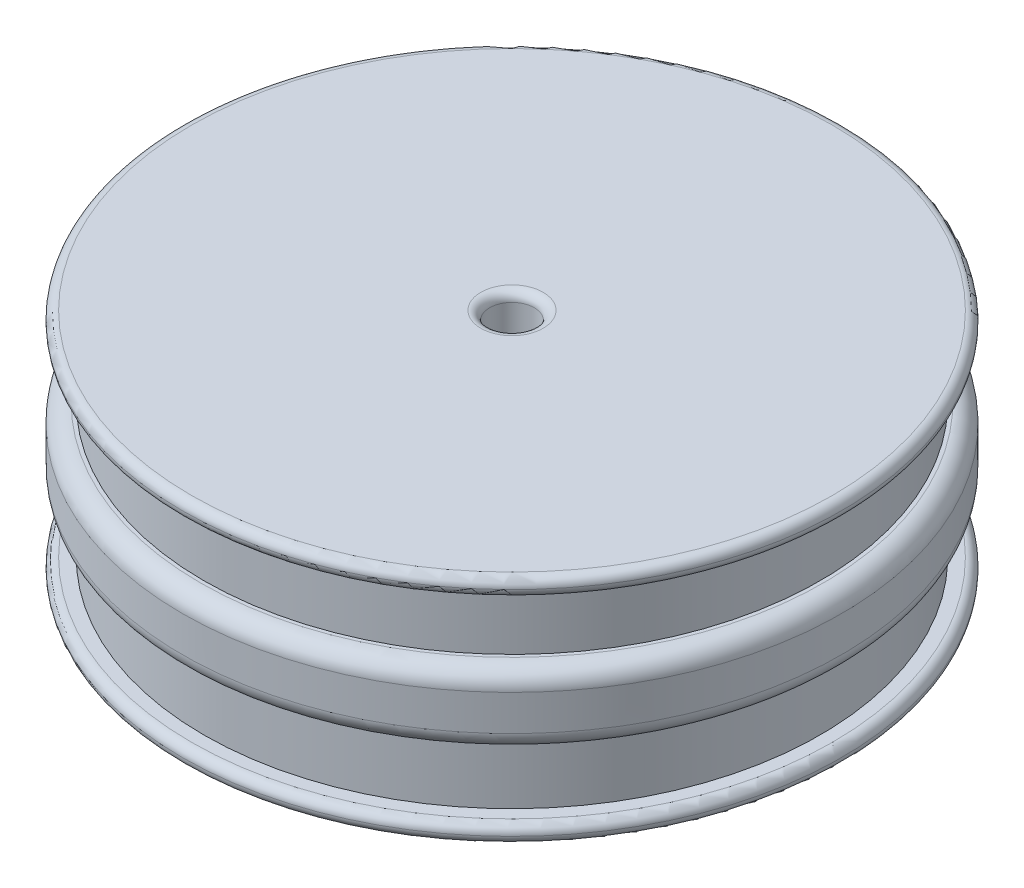
ISO-10303-21;
HEADER;
FILE_DESCRIPTION(('STEP AP214'),'2;1');
FILE_NAME('part.step','',(''),(''),'','','');
FILE_SCHEMA(('AUTOMOTIVE_DESIGN { 1 0 10303 214 1 1 1 1 }'));
ENDSEC;
DATA;
#1=APPLICATION_CONTEXT('core data for automotive mechanical design processes');
#2=APPLICATION_PROTOCOL_DEFINITION('international standard','automotive_design',2000,#1);
#3=PRODUCT_CONTEXT('',#1,'mechanical');
#4=PRODUCT('Part','Part','',(#3));
#5=PRODUCT_RELATED_PRODUCT_CATEGORY('part','',(#4));
#6=PRODUCT_DEFINITION_FORMATION('','',#4);
#7=PRODUCT_DEFINITION_CONTEXT('part definition',#1,'design');
#8=PRODUCT_DEFINITION('design','',#6,#7);
#9=PRODUCT_DEFINITION_SHAPE('','',#8);
#10=(LENGTH_UNIT() NAMED_UNIT(*) SI_UNIT(.MILLI.,.METRE.));
#11=(NAMED_UNIT(*) PLANE_ANGLE_UNIT() SI_UNIT($,.RADIAN.));
#12=(NAMED_UNIT(*) SI_UNIT($,.STERADIAN.) SOLID_ANGLE_UNIT());
#13=UNCERTAINTY_MEASURE_WITH_UNIT(LENGTH_MEASURE(1.E-05),#10,'distance_accuracy_value','');
#14=(GEOMETRIC_REPRESENTATION_CONTEXT(3) GLOBAL_UNCERTAINTY_ASSIGNED_CONTEXT((#13)) GLOBAL_UNIT_ASSIGNED_CONTEXT((#10,
#11,#12)) REPRESENTATION_CONTEXT('',''));
#15=CARTESIAN_POINT('',(0.,0.,0.));
#16=DIRECTION('',(0.,0.,1.));
#17=DIRECTION('',(1.,0.,0.));
#18=AXIS2_PLACEMENT_3D('',#15,#16,#17);
#19=CARTESIAN_POINT('',(0.,13.,0.));
#20=DIRECTION('',(0.,1.,0.));
#21=DIRECTION('',(0.,0.,1.));
#22=AXIS2_PLACEMENT_3D('',#19,#20,#21);
#23=PLANE('',#22);
#24=CARTESIAN_POINT('',(0.,13.,0.));
#25=DIRECTION('',(0.,1.,0.));
#26=DIRECTION('',(0.,0.,1.));
#27=AXIS2_PLACEMENT_3D('',#24,#25,#26);
#28=CIRCLE('',#27,1.75);
#29=CARTESIAN_POINT('',(0.,13.,1.75));
#30=VERTEX_POINT('',#29);
#31=EDGE_CURVE('E10',#30,#30,#28,.F.);
#32=ORIENTED_EDGE('',*,*,#31,.T.);
#33=EDGE_LOOP('',(#32));
#34=FACE_BOUND('',#33,.T.);
#35=CARTESIAN_POINT('',(0.,13.,0.));
#36=DIRECTION('',(0.,1.,0.));
#37=DIRECTION('',(0.,0.,1.));
#38=AXIS2_PLACEMENT_3D('',#35,#36,#37);
#39=CIRCLE('',#38,18.);
#40=CARTESIAN_POINT('',(0.,13.,18.));
#41=VERTEX_POINT('',#40);
#42=EDGE_CURVE('E65',#41,#41,#39,.T.);
#43=ORIENTED_EDGE('',*,*,#42,.T.);
#44=EDGE_LOOP('',(#43));
#45=FACE_BOUND('',#44,.T.);
#46=ADVANCED_FACE('F41',(#34,#45),#23,.T.);
#47=CARTESIAN_POINT('',(0.,0.,0.));
#48=DIRECTION('',(0.,1.,0.));
#49=DIRECTION('',(0.,0.,1.));
#50=AXIS2_PLACEMENT_3D('',#47,#48,#49);
#51=PLANE('',#50);
#52=CARTESIAN_POINT('',(0.,0.,0.));
#53=DIRECTION('',(0.,1.,0.));
#54=DIRECTION('',(0.,0.,1.));
#55=AXIS2_PLACEMENT_3D('',#52,#53,#54);
#56=CIRCLE('',#55,1.75);
#57=CARTESIAN_POINT('',(0.,0.,1.75));
#58=VERTEX_POINT('',#57);
#59=EDGE_CURVE('E59',#58,#58,#56,.T.);
#60=ORIENTED_EDGE('',*,*,#59,.T.);
#61=EDGE_LOOP('',(#60));
#62=FACE_BOUND('',#61,.T.);
#63=CARTESIAN_POINT('',(0.,0.,0.));
#64=DIRECTION('',(0.,1.,0.));
#65=DIRECTION('',(0.,0.,1.));
#66=AXIS2_PLACEMENT_3D('',#63,#64,#65);
#67=CIRCLE('',#66,18.);
#68=CARTESIAN_POINT('',(0.,0.,18.));
#69=VERTEX_POINT('',#68);
#70=EDGE_CURVE('E69',#69,#69,#67,.F.);
#71=ORIENTED_EDGE('',*,*,#70,.T.);
#72=EDGE_LOOP('',(#71));
#73=FACE_BOUND('',#72,.T.);
#74=ADVANCED_FACE('F140',(#62,#73),#51,.F.);
#75=CARTESIAN_POINT('',(0.,13.,0.));
#76=DIRECTION('',(0.,-1.,0.));
#77=DIRECTION('',(0.,0.,-1.));
#78=AXIS2_PLACEMENT_3D('',#75,#76,#77);
#79=CYLINDRICAL_SURFACE('',#78,1.25);
#80=CARTESIAN_POINT('',(0.,0.500000000000002,0.));
#81=DIRECTION('',(0.,1.,0.));
#82=DIRECTION('',(0.,0.,1.));
#83=AXIS2_PLACEMENT_3D('',#80,#81,#82);
#84=CIRCLE('',#83,1.25);
#85=CARTESIAN_POINT('',(0.,0.5,-1.25));
#86=VERTEX_POINT('',#85);
#87=EDGE_CURVE('E49',#86,#86,#84,.F.);
#88=CARTESIAN_POINT('',(0.,12.5,0.));
#89=DIRECTION('',(0.,1.,0.));
#90=DIRECTION('',(0.,0.,1.));
#91=AXIS2_PLACEMENT_3D('',#88,#89,#90);
#92=CIRCLE('',#91,1.25);
#93=CARTESIAN_POINT('',(0.,12.5,-1.25));
#94=VERTEX_POINT('',#93);
#95=EDGE_CURVE('E54',#94,#94,#92,.T.);
#96=CARTESIAN_POINT('',(0.,0.5,-1.25));
#97=CARTESIAN_POINT('',(0.,0.625000000000001,-1.25));
#98=CARTESIAN_POINT('',(0.,0.750000000000001,-1.25));
#99=CARTESIAN_POINT('',(0.,1.,-1.25));
#100=CARTESIAN_POINT('',(0.,1.125,-1.25));
#101=CARTESIAN_POINT('',(0.,1.375,-1.25));
#102=CARTESIAN_POINT('',(0.,1.5,-1.25));
#103=CARTESIAN_POINT('',(0.,1.75,-1.25));
#104=CARTESIAN_POINT('',(0.,1.875,-1.25));
#105=CARTESIAN_POINT('',(0.,2.125,-1.25));
#106=CARTESIAN_POINT('',(0.,2.25,-1.25));
#107=CARTESIAN_POINT('',(0.,2.5,-1.25));
#108=CARTESIAN_POINT('',(0.,2.625,-1.25));
#109=CARTESIAN_POINT('',(0.,2.875,-1.25));
#110=CARTESIAN_POINT('',(0.,3.,-1.25));
#111=CARTESIAN_POINT('',(0.,3.25,-1.25));
#112=CARTESIAN_POINT('',(0.,3.375,-1.25));
#113=CARTESIAN_POINT('',(0.,3.625,-1.25));
#114=CARTESIAN_POINT('',(0.,3.75,-1.25));
#115=CARTESIAN_POINT('',(0.,4.,-1.25));
#116=CARTESIAN_POINT('',(0.,4.125,-1.25));
#117=CARTESIAN_POINT('',(0.,4.375,-1.25));
#118=CARTESIAN_POINT('',(0.,4.5,-1.25));
#119=CARTESIAN_POINT('',(0.,4.75,-1.25));
#120=CARTESIAN_POINT('',(0.,4.875,-1.25));
#121=CARTESIAN_POINT('',(0.,5.125,-1.25));
#122=CARTESIAN_POINT('',(0.,5.25,-1.25));
#123=CARTESIAN_POINT('',(0.,5.5,-1.25));
#124=CARTESIAN_POINT('',(0.,5.625,-1.25));
#125=CARTESIAN_POINT('',(0.,5.875,-1.25));
#126=CARTESIAN_POINT('',(0.,6.,-1.25));
#127=CARTESIAN_POINT('',(0.,6.25,-1.25));
#128=CARTESIAN_POINT('',(0.,6.375,-1.25));
#129=CARTESIAN_POINT('',(0.,6.625,-1.25));
#130=CARTESIAN_POINT('',(0.,6.75,-1.25));
#131=CARTESIAN_POINT('',(0.,7.,-1.25));
#132=CARTESIAN_POINT('',(0.,7.125,-1.25));
#133=CARTESIAN_POINT('',(0.,7.375,-1.25));
#134=CARTESIAN_POINT('',(0.,7.5,-1.25));
#135=CARTESIAN_POINT('',(0.,7.75,-1.25));
#136=CARTESIAN_POINT('',(0.,7.875,-1.25));
#137=CARTESIAN_POINT('',(0.,8.125,-1.25));
#138=CARTESIAN_POINT('',(0.,8.25,-1.25));
#139=CARTESIAN_POINT('',(0.,8.5,-1.25));
#140=CARTESIAN_POINT('',(0.,8.625,-1.25));
#141=CARTESIAN_POINT('',(0.,8.875,-1.25));
#142=CARTESIAN_POINT('',(0.,9.,-1.25));
#143=CARTESIAN_POINT('',(0.,9.25,-1.25));
#144=CARTESIAN_POINT('',(0.,9.375,-1.25));
#145=CARTESIAN_POINT('',(0.,9.625,-1.25));
#146=CARTESIAN_POINT('',(0.,9.75,-1.25));
#147=CARTESIAN_POINT('',(0.,10.,-1.25));
#148=CARTESIAN_POINT('',(0.,10.125,-1.25));
#149=CARTESIAN_POINT('',(0.,10.375,-1.25));
#150=CARTESIAN_POINT('',(0.,10.5,-1.25));
#151=CARTESIAN_POINT('',(0.,10.75,-1.25));
#152=CARTESIAN_POINT('',(0.,10.875,-1.25));
#153=CARTESIAN_POINT('',(0.,11.125,-1.25));
#154=CARTESIAN_POINT('',(0.,11.25,-1.25));
#155=CARTESIAN_POINT('',(0.,11.5,-1.25));
#156=CARTESIAN_POINT('',(0.,11.625,-1.25));
#157=CARTESIAN_POINT('',(0.,11.875,-1.25));
#158=CARTESIAN_POINT('',(0.,12.,-1.25));
#159=CARTESIAN_POINT('',(0.,12.25,-1.25));
#160=CARTESIAN_POINT('',(0.,12.375,-1.25));
#161=CARTESIAN_POINT('',(0.,12.5,-1.25));
#162=B_SPLINE_CURVE_WITH_KNOTS('',3,(#96,#97,#98,#99,#100,#101,#102,#103,#104,#105,#106,#107,
#108,#109,#110,#111,#112,#113,#114,#115,#116,#117,#118,#119,#120,#121,#122,#123,#124,#125,#126,
#127,#128,#129,#130,#131,#132,#133,#134,#135,#136,#137,#138,#139,#140,#141,#142,#143,#144,#145,
#146,#147,#148,#149,#150,#151,#152,#153,#154,#155,#156,#157,#158,#159,#160,#161),.UNSPECIFIED.,
.F.,.F.,(4,2,2,2,2,2,2,2,2,2,2,2,2,2,2,2,2,2,2,2,2,2,2,2,2,2,2,2,2,2,2,2,4),(0.,0.375,
0.750000000000001,1.125,1.5,1.875,2.25,2.625,3.,3.375,3.75,4.125,4.5,4.875,5.25,5.625,6.,6.375,
6.75,7.125,7.5,7.875,8.25,8.625,9.,9.375,9.75,10.125,10.5,10.875,11.25,11.625,12.),.UNSPECIFIED.);
#163=EDGE_CURVE('BSEAM145',#86,#94,#162,.T.);
#164=ORIENTED_EDGE('',*,*,#87,.T.);
#165=ORIENTED_EDGE('',*,*,#95,.T.);
#166=ORIENTED_EDGE('',*,*,#163,.T.);
#167=ORIENTED_EDGE('',*,*,#163,.F.);
#168=EDGE_LOOP('',(#164,#166,#165,#167));
#169=FACE_BOUND('',#168,.T.);
#170=ADVANCED_FACE('F145',(#169),#79,.F.);
#171=CARTESIAN_POINT('',(0.,1.,18.5));
#172=DIRECTION('',(0.,1.,0.));
#173=DIRECTION('',(0.,0.,1.));
#174=AXIS2_PLACEMENT_3D('',#171,#172,#173);
#175=PLANE('',#174);
#176=CARTESIAN_POINT('',(0.,1.,0.));
#177=DIRECTION('',(0.,1.,0.));
#178=DIRECTION('',(0.,0.,1.));
#179=AXIS2_PLACEMENT_3D('',#176,#177,#178);
#180=CIRCLE('',#179,18.);
#181=CARTESIAN_POINT('',(0.,1.,18.));
#182=VERTEX_POINT('',#181);
#183=EDGE_CURVE('E73',#182,#182,#180,.T.);
#184=ORIENTED_EDGE('',*,*,#183,.T.);
#185=EDGE_LOOP('',(#184));
#186=FACE_BOUND('',#185,.T.);
#187=CARTESIAN_POINT('',(0.,1.,0.));
#188=DIRECTION('',(0.,-1.,0.));
#189=DIRECTION('',(0.,0.,-1.));
#190=AXIS2_PLACEMENT_3D('',#187,#188,#189);
#191=CIRCLE('',#190,17.3);
#192=CARTESIAN_POINT('',(0.,1.,-17.3));
#193=VERTEX_POINT('',#192);
#194=EDGE_CURVE('E106',#193,#193,#191,.T.);
#195=ORIENTED_EDGE('',*,*,#194,.T.);
#196=EDGE_LOOP('',(#195));
#197=FACE_BOUND('',#196,.T.);
#198=ADVANCED_FACE('F194',(#186,#197),#175,.T.);
#199=CARTESIAN_POINT('',(0.,-0.543449180327872,0.));
#200=DIRECTION('',(0.,-1.,0.));
#201=DIRECTION('',(0.,0.,-1.));
#202=AXIS2_PLACEMENT_3D('',#199,#200,#201);
#203=CYLINDRICAL_SURFACE('',#202,17.3);
#204=CARTESIAN_POINT('',(0.,4.5,0.));
#205=DIRECTION('',(0.,-1.,0.));
#206=DIRECTION('',(0.,0.,-1.));
#207=AXIS2_PLACEMENT_3D('',#204,#205,#206);
#208=CIRCLE('',#207,17.3);
#209=CARTESIAN_POINT('',(0.,4.5,-17.3));
#210=VERTEX_POINT('',#209);
#211=EDGE_CURVE('E111',#210,#210,#208,.T.);
#212=ORIENTED_EDGE('',*,*,#211,.T.);
#213=EDGE_LOOP('',(#212));
#214=FACE_BOUND('',#213,.T.);
#215=ORIENTED_EDGE('',*,*,#194,.F.);
#216=EDGE_LOOP('',(#215));
#217=FACE_BOUND('',#216,.T.);
#218=ADVANCED_FACE('F198',(#214,#217),#203,.T.);
#219=CARTESIAN_POINT('',(0.,4.5,18.5));
#220=DIRECTION('',(0.,-1.,0.));
#221=DIRECTION('',(0.,0.,-1.));
#222=AXIS2_PLACEMENT_3D('',#219,#220,#221);
#223=PLANE('',#222);
#224=CARTESIAN_POINT('',(0.,4.5,0.));
#225=DIRECTION('',(0.,-1.,0.));
#226=DIRECTION('',(0.,0.,-1.));
#227=AXIS2_PLACEMENT_3D('',#224,#225,#226);
#228=CIRCLE('',#227,17.5);
#229=CARTESIAN_POINT('',(0.,4.5,-17.5));
#230=VERTEX_POINT('',#229);
#231=EDGE_CURVE('E101',#230,#230,#228,.T.);
#232=ORIENTED_EDGE('',*,*,#231,.T.);
#233=EDGE_LOOP('',(#232));
#234=FACE_BOUND('',#233,.T.);
#235=ORIENTED_EDGE('',*,*,#211,.F.);
#236=EDGE_LOOP('',(#235));
#237=FACE_BOUND('',#236,.T.);
#238=ADVANCED_FACE('F203',(#234,#237),#223,.T.);
#239=CARTESIAN_POINT('',(0.,8.5,18.5));
#240=DIRECTION('',(0.,1.,0.));
#241=DIRECTION('',(0.,0.,1.));
#242=AXIS2_PLACEMENT_3D('',#239,#240,#241);
#243=PLANE('',#242);
#244=CARTESIAN_POINT('',(0.,8.5,0.));
#245=DIRECTION('',(0.,1.,0.));
#246=DIRECTION('',(0.,0.,1.));
#247=AXIS2_PLACEMENT_3D('',#244,#245,#246);
#248=CIRCLE('',#247,17.5);
#249=CARTESIAN_POINT('',(0.,8.5,17.5));
#250=VERTEX_POINT('',#249);
#251=EDGE_CURVE('E89',#250,#250,#248,.T.);
#252=ORIENTED_EDGE('',*,*,#251,.T.);
#253=EDGE_LOOP('',(#252));
#254=FACE_BOUND('',#253,.T.);
#255=CARTESIAN_POINT('',(0.,8.5,0.));
#256=DIRECTION('',(0.,-1.,0.));
#257=DIRECTION('',(0.,0.,-1.));
#258=AXIS2_PLACEMENT_3D('',#255,#256,#257);
#259=CIRCLE('',#258,17.3);
#260=CARTESIAN_POINT('',(0.,8.5,-17.3));
#261=VERTEX_POINT('',#260);
#262=EDGE_CURVE('E105',#261,#261,#259,.T.);
#263=ORIENTED_EDGE('',*,*,#262,.T.);
#264=EDGE_LOOP('',(#263));
#265=FACE_BOUND('',#264,.T.);
#266=ADVANCED_FACE('F137',(#254,#265),#243,.T.);
#267=CARTESIAN_POINT('',(0.,-0.543449180327872,0.));
#268=DIRECTION('',(0.,-1.,0.));
#269=DIRECTION('',(0.,0.,-1.));
#270=AXIS2_PLACEMENT_3D('',#267,#268,#269);
#271=CYLINDRICAL_SURFACE('',#270,17.3);
#272=CARTESIAN_POINT('',(0.,12.,0.));
#273=DIRECTION('',(0.,-1.,0.));
#274=DIRECTION('',(0.,0.,-1.));
#275=AXIS2_PLACEMENT_3D('',#272,#273,#274);
#276=CIRCLE('',#275,17.3);
#277=CARTESIAN_POINT('',(0.,12.,-17.3));
#278=VERTEX_POINT('',#277);
#279=EDGE_CURVE('E110',#278,#278,#276,.T.);
#280=ORIENTED_EDGE('',*,*,#279,.T.);
#281=EDGE_LOOP('',(#280));
#282=FACE_BOUND('',#281,.T.);
#283=ORIENTED_EDGE('',*,*,#262,.F.);
#284=EDGE_LOOP('',(#283));
#285=FACE_BOUND('',#284,.T.);
#286=ADVANCED_FACE('F122',(#282,#285),#271,.T.);
#287=CARTESIAN_POINT('',(0.,12.,18.5));
#288=DIRECTION('',(0.,-1.,0.));
#289=DIRECTION('',(0.,0.,-1.));
#290=AXIS2_PLACEMENT_3D('',#287,#288,#289);
#291=PLANE('',#290);
#292=CARTESIAN_POINT('',(0.,12.,0.));
#293=DIRECTION('',(0.,-1.,0.));
#294=DIRECTION('',(0.,0.,-1.));
#295=AXIS2_PLACEMENT_3D('',#292,#293,#294);
#296=CIRCLE('',#295,18.);
#297=CARTESIAN_POINT('',(0.,12.,-18.));
#298=VERTEX_POINT('',#297);
#299=EDGE_CURVE('E85',#298,#298,#296,.T.);
#300=ORIENTED_EDGE('',*,*,#299,.T.);
#301=EDGE_LOOP('',(#300));
#302=FACE_BOUND('',#301,.T.);
#303=ORIENTED_EDGE('',*,*,#279,.F.);
#304=EDGE_LOOP('',(#303));
#305=FACE_BOUND('',#304,.T.);
#306=ADVANCED_FACE('F125',(#302,#305),#291,.T.);
#307=CARTESIAN_POINT('',(0.,13.,0.));
#308=DIRECTION('',(0.,-1.,0.));
#309=DIRECTION('',(0.,0.,-1.));
#310=AXIS2_PLACEMENT_3D('',#307,#308,#309);
#311=CYLINDRICAL_SURFACE('',#310,18.5);
#312=CARTESIAN_POINT('',(0.,5.5,0.));
#313=DIRECTION('',(0.,-1.,0.));
#314=DIRECTION('',(0.,0.,-1.));
#315=AXIS2_PLACEMENT_3D('',#312,#313,#314);
#316=CIRCLE('',#315,18.5);
#317=CARTESIAN_POINT('',(0.,5.5,-18.5));
#318=VERTEX_POINT('',#317);
#319=EDGE_CURVE('E93',#318,#318,#316,.F.);
#320=CARTESIAN_POINT('',(0.,7.5,0.));
#321=DIRECTION('',(0.,1.,0.));
#322=DIRECTION('',(0.,0.,1.));
#323=AXIS2_PLACEMENT_3D('',#320,#321,#322);
#324=CIRCLE('',#323,18.5);
#325=CARTESIAN_POINT('',(0.,7.5,-18.5));
#326=VERTEX_POINT('',#325);
#327=EDGE_CURVE('E97',#326,#326,#324,.F.);
#328=CARTESIAN_POINT('',(0.,5.5,-18.5));
#329=CARTESIAN_POINT('',(0.,5.52083333333333,-18.5));
#330=CARTESIAN_POINT('',(0.,5.54166666666667,-18.5));
#331=CARTESIAN_POINT('',(0.,5.58333333333333,-18.5));
#332=CARTESIAN_POINT('',(0.,5.60416666666667,-18.5));
#333=CARTESIAN_POINT('',(0.,5.64583333333333,-18.5));
#334=CARTESIAN_POINT('',(0.,5.66666666666667,-18.5));
#335=CARTESIAN_POINT('',(0.,5.70833333333333,-18.5));
#336=CARTESIAN_POINT('',(0.,5.72916666666667,-18.5));
#337=CARTESIAN_POINT('',(0.,5.77083333333333,-18.5));
#338=CARTESIAN_POINT('',(0.,5.79166666666667,-18.5));
#339=CARTESIAN_POINT('',(0.,5.83333333333333,-18.5));
#340=CARTESIAN_POINT('',(0.,5.85416666666667,-18.5));
#341=CARTESIAN_POINT('',(0.,5.89583333333333,-18.5));
#342=CARTESIAN_POINT('',(0.,5.91666666666667,-18.5));
#343=CARTESIAN_POINT('',(0.,5.95833333333333,-18.5));
#344=CARTESIAN_POINT('',(0.,5.97916666666667,-18.5));
#345=CARTESIAN_POINT('',(0.,6.02083333333333,-18.5));
#346=CARTESIAN_POINT('',(0.,6.04166666666667,-18.5));
#347=CARTESIAN_POINT('',(0.,6.08333333333333,-18.5));
#348=CARTESIAN_POINT('',(0.,6.10416666666667,-18.5));
#349=CARTESIAN_POINT('',(0.,6.14583333333333,-18.5));
#350=CARTESIAN_POINT('',(0.,6.16666666666667,-18.5));
#351=CARTESIAN_POINT('',(0.,6.20833333333333,-18.5));
#352=CARTESIAN_POINT('',(0.,6.22916666666667,-18.5));
#353=CARTESIAN_POINT('',(0.,6.27083333333333,-18.5));
#354=CARTESIAN_POINT('',(0.,6.29166666666667,-18.5));
#355=CARTESIAN_POINT('',(0.,6.33333333333333,-18.5));
#356=CARTESIAN_POINT('',(0.,6.35416666666667,-18.5));
#357=CARTESIAN_POINT('',(0.,6.39583333333333,-18.5));
#358=CARTESIAN_POINT('',(0.,6.41666666666667,-18.5));
#359=CARTESIAN_POINT('',(0.,6.45833333333333,-18.5));
#360=CARTESIAN_POINT('',(0.,6.47916666666667,-18.5));
#361=CARTESIAN_POINT('',(0.,6.52083333333333,-18.5));
#362=CARTESIAN_POINT('',(0.,6.54166666666667,-18.5));
#363=CARTESIAN_POINT('',(0.,6.58333333333333,-18.5));
#364=CARTESIAN_POINT('',(0.,6.60416666666667,-18.5));
#365=CARTESIAN_POINT('',(0.,6.64583333333333,-18.5));
#366=CARTESIAN_POINT('',(0.,6.66666666666667,-18.5));
#367=CARTESIAN_POINT('',(0.,6.70833333333333,-18.5));
#368=CARTESIAN_POINT('',(0.,6.72916666666667,-18.5));
#369=CARTESIAN_POINT('',(0.,6.77083333333333,-18.5));
#370=CARTESIAN_POINT('',(0.,6.79166666666667,-18.5));
#371=CARTESIAN_POINT('',(0.,6.83333333333333,-18.5));
#372=CARTESIAN_POINT('',(0.,6.85416666666667,-18.5));
#373=CARTESIAN_POINT('',(0.,6.89583333333333,-18.5));
#374=CARTESIAN_POINT('',(0.,6.91666666666667,-18.5));
#375=CARTESIAN_POINT('',(0.,6.95833333333333,-18.5));
#376=CARTESIAN_POINT('',(0.,6.97916666666667,-18.5));
#377=CARTESIAN_POINT('',(0.,7.02083333333333,-18.5));
#378=CARTESIAN_POINT('',(0.,7.04166666666667,-18.5));
#379=CARTESIAN_POINT('',(0.,7.08333333333333,-18.5));
#380=CARTESIAN_POINT('',(0.,7.10416666666667,-18.5));
#381=CARTESIAN_POINT('',(0.,7.14583333333333,-18.5));
#382=CARTESIAN_POINT('',(0.,7.16666666666667,-18.5));
#383=CARTESIAN_POINT('',(0.,7.20833333333333,-18.5));
#384=CARTESIAN_POINT('',(0.,7.22916666666667,-18.5));
#385=CARTESIAN_POINT('',(0.,7.27083333333333,-18.5));
#386=CARTESIAN_POINT('',(0.,7.29166666666667,-18.5));
#387=CARTESIAN_POINT('',(0.,7.33333333333333,-18.5));
#388=CARTESIAN_POINT('',(0.,7.35416666666667,-18.5));
#389=CARTESIAN_POINT('',(0.,7.39583333333333,-18.5));
#390=CARTESIAN_POINT('',(0.,7.41666666666667,-18.5));
#391=CARTESIAN_POINT('',(0.,7.45833333333333,-18.5));
#392=CARTESIAN_POINT('',(0.,7.47916666666667,-18.5));
#393=CARTESIAN_POINT('',(0.,7.5,-18.5));
#394=B_SPLINE_CURVE_WITH_KNOTS('',3,(#328,#329,#330,#331,#332,#333,#334,#335,#336,#337,#338,
#339,#340,#341,#342,#343,#344,#345,#346,#347,#348,#349,#350,#351,#352,#353,#354,#355,#356,#357,
#358,#359,#360,#361,#362,#363,#364,#365,#366,#367,#368,#369,#370,#371,#372,#373,#374,#375,#376,
#377,#378,#379,#380,#381,#382,#383,#384,#385,#386,#387,#388,#389,#390,#391,#392,#393),
.UNSPECIFIED.,.F.,.F.,(4,2,2,2,2,2,2,2,2,2,2,2,2,2,2,2,2,2,2,2,2,2,2,2,2,2,2,2,2,2,2,2,4),(0.,
0.0625000000000001,0.125,0.1875,0.25,0.3125,0.375,0.4375,0.5,0.5625,0.625,0.6875,0.75,0.8125,
0.875,0.9375,1.,1.0625,1.125,1.1875,1.25,1.3125,1.375,1.4375,1.5,1.5625,1.625,1.6875,1.75,
1.8125,1.875,1.9375,2.),.UNSPECIFIED.);
#395=EDGE_CURVE('BSEAM127',#318,#326,#394,.T.);
#396=ORIENTED_EDGE('',*,*,#319,.T.);
#397=ORIENTED_EDGE('',*,*,#327,.T.);
#398=ORIENTED_EDGE('',*,*,#395,.T.);
#399=ORIENTED_EDGE('',*,*,#395,.F.);
#400=EDGE_LOOP('',(#396,#398,#397,#399));
#401=FACE_BOUND('',#400,.T.);
#402=ADVANCED_FACE('F127',(#401),#311,.T.);
#403=CARTESIAN_POINT('',(0.,5.5,0.));
#404=DIRECTION('',(0.,-1.,0.));
#405=DIRECTION('',(0.,0.,-1.));
#406=AXIS2_PLACEMENT_3D('',#403,#404,#405);
#407=TOROIDAL_SURFACE('',#406,17.5,1.);
#408=ORIENTED_EDGE('',*,*,#319,.F.);
#409=EDGE_LOOP('',(#408));
#410=FACE_BOUND('',#409,.T.);
#411=ORIENTED_EDGE('',*,*,#231,.F.);
#412=EDGE_LOOP('',(#411));
#413=FACE_BOUND('',#412,.T.);
#414=ADVANCED_FACE('F134',(#410,#413),#407,.T.);
#415=CARTESIAN_POINT('',(0.,7.5,0.));
#416=DIRECTION('',(0.,1.,0.));
#417=DIRECTION('',(0.,0.,1.));
#418=AXIS2_PLACEMENT_3D('',#415,#416,#417);
#419=TOROIDAL_SURFACE('',#418,17.5,1.);
#420=ORIENTED_EDGE('',*,*,#251,.F.);
#421=EDGE_LOOP('',(#420));
#422=FACE_BOUND('',#421,.T.);
#423=ORIENTED_EDGE('',*,*,#327,.F.);
#424=EDGE_LOOP('',(#423));
#425=FACE_BOUND('',#424,.T.);
#426=ADVANCED_FACE('F154',(#422,#425),#419,.T.);
#427=CARTESIAN_POINT('',(0.,12.5,0.));
#428=DIRECTION('',(0.,-1.,0.));
#429=DIRECTION('',(0.,0.,-1.));
#430=AXIS2_PLACEMENT_3D('',#427,#428,#429);
#431=TOROIDAL_SURFACE('',#430,18.,0.5);
#432=CARTESIAN_POINT('',(0.,12.5,0.));
#433=DIRECTION('',(0.,-1.,0.));
#434=DIRECTION('',(0.,0.,-1.));
#435=AXIS2_PLACEMENT_3D('',#432,#433,#434);
#436=CIRCLE('',#435,18.5);
#437=CARTESIAN_POINT('',(0.,12.5,-18.5));
#438=VERTEX_POINT('',#437);
#439=EDGE_CURVE('E81',#438,#438,#436,.F.);
#440=ORIENTED_EDGE('',*,*,#439,.F.);
#441=EDGE_LOOP('',(#440));
#442=FACE_BOUND('',#441,.T.);
#443=ORIENTED_EDGE('',*,*,#299,.F.);
#444=EDGE_LOOP('',(#443));
#445=FACE_BOUND('',#444,.T.);
#446=ADVANCED_FACE('F158',(#442,#445),#431,.T.);
#447=CARTESIAN_POINT('',(0.,0.5,0.));
#448=DIRECTION('',(0.,1.,0.));
#449=DIRECTION('',(0.,0.,1.));
#450=AXIS2_PLACEMENT_3D('',#447,#448,#449);
#451=TOROIDAL_SURFACE('',#450,18.,0.5);
#452=ORIENTED_EDGE('',*,*,#183,.F.);
#453=EDGE_LOOP('',(#452));
#454=FACE_BOUND('',#453,.T.);
#455=CARTESIAN_POINT('',(0.,0.5,0.));
#456=DIRECTION('',(0.,1.,0.));
#457=DIRECTION('',(0.,0.,1.));
#458=AXIS2_PLACEMENT_3D('',#455,#456,#457);
#459=CIRCLE('',#458,18.5);
#460=CARTESIAN_POINT('',(0.,0.5,18.5));
#461=VERTEX_POINT('',#460);
#462=EDGE_CURVE('E77',#461,#461,#459,.F.);
#463=ORIENTED_EDGE('',*,*,#462,.F.);
#464=EDGE_LOOP('',(#463));
#465=FACE_BOUND('',#464,.T.);
#466=ADVANCED_FACE('F162',(#454,#465),#451,.T.);
#467=CARTESIAN_POINT('',(0.,0.5,0.));
#468=DIRECTION('',(0.,1.,0.));
#469=DIRECTION('',(0.,0.,1.));
#470=AXIS2_PLACEMENT_3D('',#467,#468,#469);
#471=TOROIDAL_SURFACE('',#470,18.,0.5);
#472=ORIENTED_EDGE('',*,*,#70,.F.);
#473=EDGE_LOOP('',(#472));
#474=FACE_BOUND('',#473,.T.);
#475=ORIENTED_EDGE('',*,*,#462,.T.);
#476=EDGE_LOOP('',(#475));
#477=FACE_BOUND('',#476,.T.);
#478=ADVANCED_FACE('F166',(#474,#477),#471,.T.);
#479=CARTESIAN_POINT('',(0.,12.5,0.));
#480=DIRECTION('',(0.,1.,0.));
#481=DIRECTION('',(0.,0.,1.));
#482=AXIS2_PLACEMENT_3D('',#479,#480,#481);
#483=TOROIDAL_SURFACE('',#482,18.,0.5);
#484=ORIENTED_EDGE('',*,*,#439,.T.);
#485=EDGE_LOOP('',(#484));
#486=FACE_BOUND('',#485,.T.);
#487=ORIENTED_EDGE('',*,*,#42,.F.);
#488=EDGE_LOOP('',(#487));
#489=FACE_BOUND('',#488,.T.);
#490=ADVANCED_FACE('F170',(#486,#489),#483,.T.);
#491=CARTESIAN_POINT('',(0.,0.5,0.));
#492=DIRECTION('',(0.,1.,0.));
#493=DIRECTION('',(0.,0.,1.));
#494=AXIS2_PLACEMENT_3D('',#491,#492,#493);
#495=TOROIDAL_SURFACE('',#494,1.75,0.5);
#496=ORIENTED_EDGE('',*,*,#87,.F.);
#497=EDGE_LOOP('',(#496));
#498=FACE_BOUND('',#497,.T.);
#499=ORIENTED_EDGE('',*,*,#59,.F.);
#500=EDGE_LOOP('',(#499));
#501=FACE_BOUND('',#500,.T.);
#502=ADVANCED_FACE('F173',(#498,#501),#495,.T.);
#503=CARTESIAN_POINT('',(0.,12.5,0.));
#504=DIRECTION('',(0.,1.,0.));
#505=DIRECTION('',(0.,0.,1.));
#506=AXIS2_PLACEMENT_3D('',#503,#504,#505);
#507=TOROIDAL_SURFACE('',#506,1.75,0.5);
#508=ORIENTED_EDGE('',*,*,#31,.F.);
#509=EDGE_LOOP('',(#508));
#510=FACE_BOUND('',#509,.T.);
#511=ORIENTED_EDGE('',*,*,#95,.F.);
#512=EDGE_LOOP('',(#511));
#513=FACE_BOUND('',#512,.T.);
#514=ADVANCED_FACE('F43',(#510,#513),#507,.T.);
#515=CLOSED_SHELL('',(#46,#74,#170,#198,#218,#238,#266,#286,#306,#402,#414,#426,#446,#466,#478,
#490,#502,#514));
#516=MANIFOLD_SOLID_BREP('B2',#515);
#517=ADVANCED_BREP_SHAPE_REPRESENTATION('',(#18,#516),#14);
#518=SHAPE_DEFINITION_REPRESENTATION(#9,#517);
ENDSEC;
END-ISO-10303-21;
